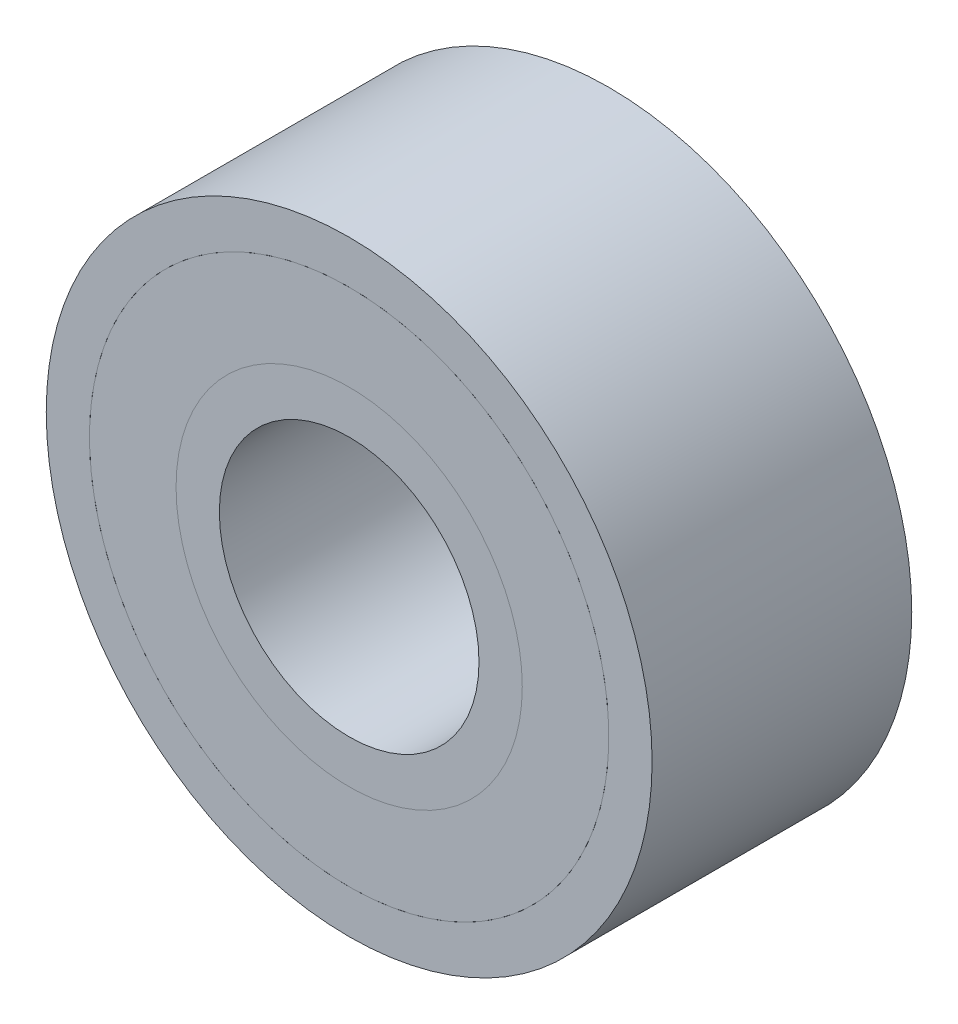
ISO-10303-21;
HEADER;
FILE_DESCRIPTION(('STEP AP214'),'2;1');
FILE_NAME('part.step','',(''),(''),'','','');
FILE_SCHEMA(('AUTOMOTIVE_DESIGN { 1 0 10303 214 1 1 1 1 }'));
ENDSEC;
DATA;
#1=APPLICATION_CONTEXT('core data for automotive mechanical design processes');
#2=APPLICATION_PROTOCOL_DEFINITION('international standard','automotive_design',2000,#1);
#3=PRODUCT_CONTEXT('',#1,'mechanical');
#4=PRODUCT('Part','Part','',(#3));
#5=PRODUCT_RELATED_PRODUCT_CATEGORY('part','',(#4));
#6=PRODUCT_DEFINITION_FORMATION('','',#4);
#7=PRODUCT_DEFINITION_CONTEXT('part definition',#1,'design');
#8=PRODUCT_DEFINITION('design','',#6,#7);
#9=PRODUCT_DEFINITION_SHAPE('','',#8);
#10=(LENGTH_UNIT() NAMED_UNIT(*) SI_UNIT(.MILLI.,.METRE.));
#11=(NAMED_UNIT(*) PLANE_ANGLE_UNIT() SI_UNIT($,.RADIAN.));
#12=(NAMED_UNIT(*) SI_UNIT($,.STERADIAN.) SOLID_ANGLE_UNIT());
#13=UNCERTAINTY_MEASURE_WITH_UNIT(LENGTH_MEASURE(1.E-05),#10,'distance_accuracy_value','');
#14=(GEOMETRIC_REPRESENTATION_CONTEXT(3) GLOBAL_UNCERTAINTY_ASSIGNED_CONTEXT((#13)) GLOBAL_UNIT_ASSIGNED_CONTEXT((#10,
#11,#12)) REPRESENTATION_CONTEXT('',''));
#15=CARTESIAN_POINT('',(0.,0.,0.));
#16=DIRECTION('',(0.,0.,1.));
#17=DIRECTION('',(1.,0.,0.));
#18=AXIS2_PLACEMENT_3D('',#15,#16,#17);
#19=CARTESIAN_POINT('',(0.,0.,45.9411254969543));
#20=DIRECTION('',(0.,0.,-1.));
#21=DIRECTION('',(-1.,0.,0.));
#22=AXIS2_PLACEMENT_3D('',#19,#20,#21);
#23=CYLINDRICAL_SURFACE('',#22,12.);
#24=CARTESIAN_POINT('',(0.,0.,0.));
#25=DIRECTION('',(0.,0.,1.));
#26=DIRECTION('',(1.,0.,0.));
#27=AXIS2_PLACEMENT_3D('',#24,#25,#26);
#28=CIRCLE('',#27,12.);
#29=CARTESIAN_POINT('',(12.,0.,0.));
#30=VERTEX_POINT('',#29);
#31=EDGE_CURVE('E59',#30,#30,#28,.T.);
#32=ORIENTED_EDGE('',*,*,#31,.T.);
#33=EDGE_LOOP('',(#32));
#34=FACE_BOUND('',#33,.T.);
#35=CARTESIAN_POINT('',(0.,0.,12.));
#36=DIRECTION('',(0.,0.,1.));
#37=DIRECTION('',(1.,0.,0.));
#38=AXIS2_PLACEMENT_3D('',#35,#36,#37);
#39=CIRCLE('',#38,12.);
#40=CARTESIAN_POINT('',(12.,0.,12.));
#41=VERTEX_POINT('',#40);
#42=EDGE_CURVE('E11',#41,#41,#39,.T.);
#43=ORIENTED_EDGE('',*,*,#42,.F.);
#44=EDGE_LOOP('',(#43));
#45=FACE_BOUND('',#44,.T.);
#46=ADVANCED_FACE('F52',(#34,#45),#23,.T.);
#47=CARTESIAN_POINT('',(0.,0.,0.));
#48=DIRECTION('',(0.,0.,1.));
#49=DIRECTION('',(1.,0.,0.));
#50=AXIS2_PLACEMENT_3D('',#47,#48,#49);
#51=PLANE('',#50);
#52=ORIENTED_EDGE('',*,*,#31,.F.);
#53=EDGE_LOOP('',(#52));
#54=FACE_BOUND('',#53,.T.);
#55=CARTESIAN_POINT('',(0.,0.,0.));
#56=DIRECTION('',(0.,0.,1.));
#57=DIRECTION('',(1.,0.,0.));
#58=AXIS2_PLACEMENT_3D('',#55,#56,#57);
#59=CIRCLE('',#58,8.);
#60=CARTESIAN_POINT('',(8.,0.,0.));
#61=VERTEX_POINT('',#60);
#62=EDGE_CURVE('E64',#61,#61,#59,.T.);
#63=ORIENTED_EDGE('',*,*,#62,.T.);
#64=EDGE_LOOP('',(#63));
#65=FACE_BOUND('',#64,.T.);
#66=ADVANCED_FACE('F80',(#54,#65),#51,.F.);
#67=CARTESIAN_POINT('',(0.,0.,45.9411254969543));
#68=DIRECTION('',(0.,0.,-1.));
#69=DIRECTION('',(-1.,0.,0.));
#70=AXIS2_PLACEMENT_3D('',#67,#68,#69);
#71=CYLINDRICAL_SURFACE('',#70,8.);
#72=ORIENTED_EDGE('',*,*,#62,.F.);
#73=EDGE_LOOP('',(#72));
#74=FACE_BOUND('',#73,.T.);
#75=CARTESIAN_POINT('',(0.,0.,12.));
#76=DIRECTION('',(0.,0.,1.));
#77=DIRECTION('',(1.,0.,0.));
#78=AXIS2_PLACEMENT_3D('',#75,#76,#77);
#79=CIRCLE('',#78,8.);
#80=CARTESIAN_POINT('',(8.,0.,12.));
#81=VERTEX_POINT('',#80);
#82=EDGE_CURVE('E55',#81,#81,#79,.T.);
#83=ORIENTED_EDGE('',*,*,#82,.T.);
#84=EDGE_LOOP('',(#83));
#85=FACE_BOUND('',#84,.T.);
#86=ADVANCED_FACE('F72',(#74,#85),#71,.F.);
#87=CARTESIAN_POINT('',(0.,0.,12.));
#88=DIRECTION('',(0.,0.,1.));
#89=DIRECTION('',(1.,0.,0.));
#90=AXIS2_PLACEMENT_3D('',#87,#88,#89);
#91=PLANE('',#90);
#92=ORIENTED_EDGE('',*,*,#82,.F.);
#93=EDGE_LOOP('',(#92));
#94=FACE_BOUND('',#93,.T.);
#95=ORIENTED_EDGE('',*,*,#42,.T.);
#96=EDGE_LOOP('',(#95));
#97=FACE_BOUND('',#96,.T.);
#98=ADVANCED_FACE('F74',(#94,#97),#91,.T.);
#99=CLOSED_SHELL('',(#46,#66,#86,#98));
#100=MANIFOLD_SOLID_BREP('B2',#99);
#101=CARTESIAN_POINT('',(0.,0.,12.));
#102=DIRECTION('',(0.,0.,1.));
#103=DIRECTION('',(1.,0.,0.));
#104=AXIS2_PLACEMENT_3D('',#101,#102,#103);
#105=PLANE('',#104);
#106=CARTESIAN_POINT('',(0.,0.,12.));
#107=DIRECTION('',(0.,0.,-1.));
#108=DIRECTION('',(-1.,0.,0.));
#109=AXIS2_PLACEMENT_3D('',#106,#107,#108);
#110=CIRCLE('',#109,12.);
#111=CARTESIAN_POINT('',(-12.,0.,12.));
#112=VERTEX_POINT('',#111);
#113=EDGE_CURVE('E141',#112,#112,#110,.T.);
#114=ORIENTED_EDGE('',*,*,#113,.T.);
#115=EDGE_LOOP('',(#114));
#116=FACE_BOUND('',#115,.T.);
#117=CARTESIAN_POINT('',(0.,0.,12.));
#118=DIRECTION('',(0.,0.,1.));
#119=DIRECTION('',(1.,0.,0.));
#120=AXIS2_PLACEMENT_3D('',#117,#118,#119);
#121=CIRCLE('',#120,14.);
#122=CARTESIAN_POINT('',(14.,0.,12.));
#123=VERTEX_POINT('',#122);
#124=EDGE_CURVE('E149',#123,#123,#121,.T.);
#125=ORIENTED_EDGE('',*,*,#124,.T.);
#126=EDGE_LOOP('',(#125));
#127=FACE_BOUND('',#126,.T.);
#128=ADVANCED_FACE('F137',(#116,#127),#105,.T.);
#129=CARTESIAN_POINT('',(0.,0.,0.));
#130=DIRECTION('',(0.,0.,1.));
#131=DIRECTION('',(1.,0.,0.));
#132=AXIS2_PLACEMENT_3D('',#129,#130,#131);
#133=PLANE('',#132);
#134=CARTESIAN_POINT('',(0.,0.,0.));
#135=DIRECTION('',(0.,0.,-1.));
#136=DIRECTION('',(-1.,0.,0.));
#137=AXIS2_PLACEMENT_3D('',#134,#135,#136);
#138=CIRCLE('',#137,12.);
#139=CARTESIAN_POINT('',(-12.,0.,0.));
#140=VERTEX_POINT('',#139);
#141=EDGE_CURVE('E51',#140,#140,#138,.T.);
#142=ORIENTED_EDGE('',*,*,#141,.F.);
#143=EDGE_LOOP('',(#142));
#144=FACE_BOUND('',#143,.T.);
#145=CARTESIAN_POINT('',(0.,0.,0.));
#146=DIRECTION('',(0.,0.,1.));
#147=DIRECTION('',(1.,0.,0.));
#148=AXIS2_PLACEMENT_3D('',#145,#146,#147);
#149=CIRCLE('',#148,14.);
#150=CARTESIAN_POINT('',(14.,0.,0.));
#151=VERTEX_POINT('',#150);
#152=EDGE_CURVE('E145',#151,#151,#149,.T.);
#153=ORIENTED_EDGE('',*,*,#152,.F.);
#154=EDGE_LOOP('',(#153));
#155=FACE_BOUND('',#154,.T.);
#156=ADVANCED_FACE('F139',(#144,#155),#133,.F.);
#157=CARTESIAN_POINT('',(0.,0.,12.));
#158=DIRECTION('',(0.,0.,-1.));
#159=DIRECTION('',(-1.,0.,0.));
#160=AXIS2_PLACEMENT_3D('',#157,#158,#159);
#161=CYLINDRICAL_SURFACE('',#160,14.);
#162=ORIENTED_EDGE('',*,*,#124,.F.);
#163=EDGE_LOOP('',(#162));
#164=FACE_BOUND('',#163,.T.);
#165=ORIENTED_EDGE('',*,*,#152,.T.);
#166=EDGE_LOOP('',(#165));
#167=FACE_BOUND('',#166,.T.);
#168=ADVANCED_FACE('F161',(#164,#167),#161,.T.);
#169=CARTESIAN_POINT('',(0.,0.,12.));
#170=DIRECTION('',(0.,0.,-1.));
#171=DIRECTION('',(-1.,0.,0.));
#172=AXIS2_PLACEMENT_3D('',#169,#170,#171);
#173=CYLINDRICAL_SURFACE('',#172,12.);
#174=ORIENTED_EDGE('',*,*,#113,.F.);
#175=EDGE_LOOP('',(#174));
#176=FACE_BOUND('',#175,.T.);
#177=ORIENTED_EDGE('',*,*,#141,.T.);
#178=EDGE_LOOP('',(#177));
#179=FACE_BOUND('',#178,.T.);
#180=ADVANCED_FACE('F159',(#176,#179),#173,.F.);
#181=CLOSED_SHELL('',(#128,#156,#168,#180));
#182=MANIFOLD_SOLID_BREP('B6',#181);
#183=CARTESIAN_POINT('',(0.,0.,12.));
#184=DIRECTION('',(0.,0.,1.));
#185=DIRECTION('',(1.,0.,0.));
#186=AXIS2_PLACEMENT_3D('',#183,#184,#185);
#187=PLANE('',#186);
#188=CARTESIAN_POINT('',(0.,0.,12.));
#189=DIRECTION('',(0.,0.,1.));
#190=DIRECTION('',(1.,0.,0.));
#191=AXIS2_PLACEMENT_3D('',#188,#189,#190);
#192=CIRCLE('',#191,6.);
#193=CARTESIAN_POINT('',(6.,0.,12.));
#194=VERTEX_POINT('',#193);
#195=EDGE_CURVE('E136',#194,#194,#192,.T.);
#196=ORIENTED_EDGE('',*,*,#195,.F.);
#197=EDGE_LOOP('',(#196));
#198=FACE_BOUND('',#197,.T.);
#199=CARTESIAN_POINT('',(0.,0.,12.));
#200=DIRECTION('',(0.,0.,-1.));
#201=DIRECTION('',(-1.,0.,0.));
#202=AXIS2_PLACEMENT_3D('',#199,#200,#201);
#203=CIRCLE('',#202,8.);
#204=CARTESIAN_POINT('',(-8.,0.,12.));
#205=VERTEX_POINT('',#204);
#206=EDGE_CURVE('E210',#205,#205,#203,.T.);
#207=ORIENTED_EDGE('',*,*,#206,.F.);
#208=EDGE_LOOP('',(#207));
#209=FACE_BOUND('',#208,.T.);
#210=ADVANCED_FACE('F199',(#198,#209),#187,.T.);
#211=CARTESIAN_POINT('',(0.,0.,12.));
#212=DIRECTION('',(0.,0.,-1.));
#213=DIRECTION('',(-1.,0.,0.));
#214=AXIS2_PLACEMENT_3D('',#211,#212,#213);
#215=CYLINDRICAL_SURFACE('',#214,6.);
#216=ORIENTED_EDGE('',*,*,#195,.T.);
#217=EDGE_LOOP('',(#216));
#218=FACE_BOUND('',#217,.T.);
#219=CARTESIAN_POINT('',(0.,0.,0.));
#220=DIRECTION('',(0.,0.,1.));
#221=DIRECTION('',(1.,0.,0.));
#222=AXIS2_PLACEMENT_3D('',#219,#220,#221);
#223=CIRCLE('',#222,6.);
#224=CARTESIAN_POINT('',(6.,0.,0.));
#225=VERTEX_POINT('',#224);
#226=EDGE_CURVE('E203',#225,#225,#223,.T.);
#227=ORIENTED_EDGE('',*,*,#226,.F.);
#228=EDGE_LOOP('',(#227));
#229=FACE_BOUND('',#228,.T.);
#230=ADVANCED_FACE('F222',(#218,#229),#215,.F.);
#231=CARTESIAN_POINT('',(0.,0.,0.));
#232=DIRECTION('',(0.,0.,1.));
#233=DIRECTION('',(1.,0.,0.));
#234=AXIS2_PLACEMENT_3D('',#231,#232,#233);
#235=PLANE('',#234);
#236=ORIENTED_EDGE('',*,*,#226,.T.);
#237=EDGE_LOOP('',(#236));
#238=FACE_BOUND('',#237,.T.);
#239=CARTESIAN_POINT('',(0.,0.,0.));
#240=DIRECTION('',(0.,0.,-1.));
#241=DIRECTION('',(-1.,0.,0.));
#242=AXIS2_PLACEMENT_3D('',#239,#240,#241);
#243=CIRCLE('',#242,8.);
#244=CARTESIAN_POINT('',(-8.,0.,0.));
#245=VERTEX_POINT('',#244);
#246=EDGE_CURVE('E212',#245,#245,#243,.T.);
#247=ORIENTED_EDGE('',*,*,#246,.T.);
#248=EDGE_LOOP('',(#247));
#249=FACE_BOUND('',#248,.T.);
#250=ADVANCED_FACE('F201',(#238,#249),#235,.F.);
#251=CARTESIAN_POINT('',(0.,0.,12.));
#252=DIRECTION('',(0.,0.,-1.));
#253=DIRECTION('',(-1.,0.,0.));
#254=AXIS2_PLACEMENT_3D('',#251,#252,#253);
#255=CYLINDRICAL_SURFACE('',#254,8.);
#256=ORIENTED_EDGE('',*,*,#206,.T.);
#257=EDGE_LOOP('',(#256));
#258=FACE_BOUND('',#257,.T.);
#259=ORIENTED_EDGE('',*,*,#246,.F.);
#260=EDGE_LOOP('',(#259));
#261=FACE_BOUND('',#260,.T.);
#262=ADVANCED_FACE('F218',(#258,#261),#255,.T.);
#263=CLOSED_SHELL('',(#210,#230,#250,#262));
#264=MANIFOLD_SOLID_BREP('B46',#263);
#265=ADVANCED_BREP_SHAPE_REPRESENTATION('',(#18,#100,#182,#264),#14);
#266=SHAPE_DEFINITION_REPRESENTATION(#9,#265);
ENDSEC;
END-ISO-10303-21;
